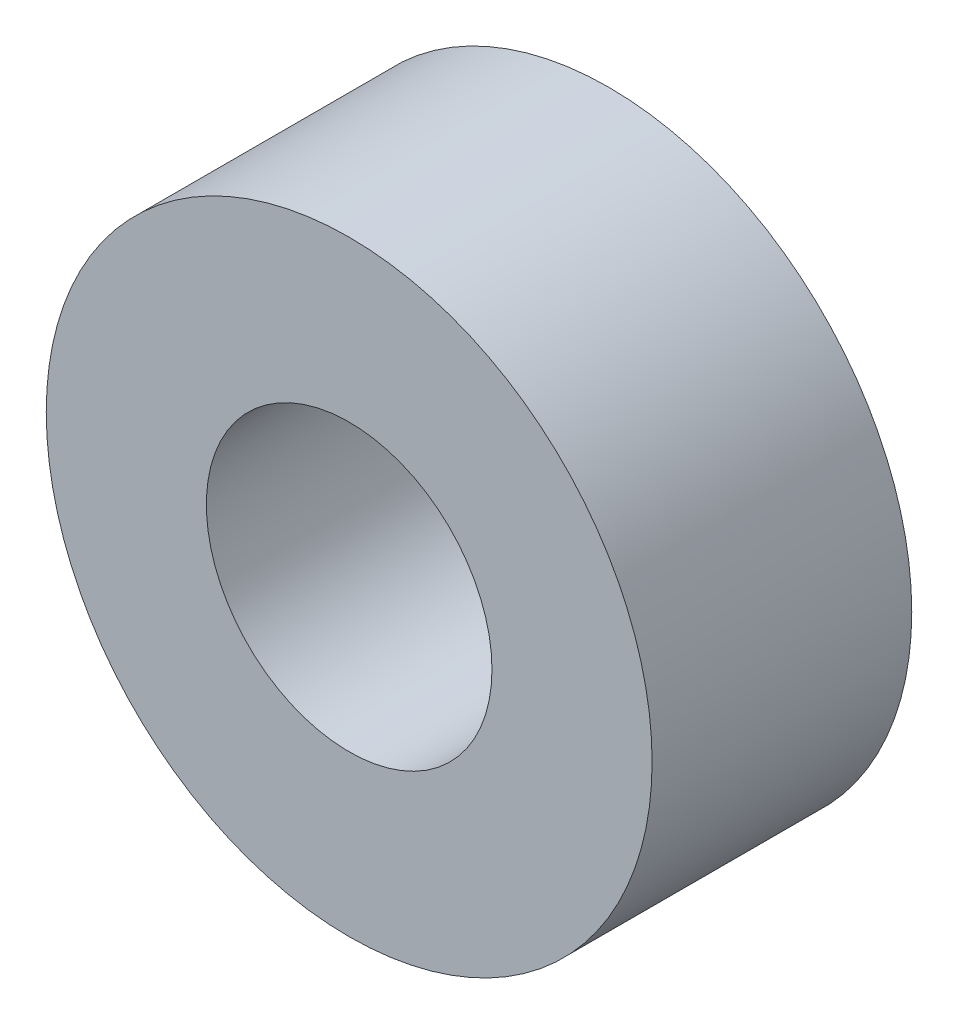
ISO-10303-21;
HEADER;
FILE_DESCRIPTION(('STEP AP214'),'2;1');
FILE_NAME('part.step','',(''),(''),'','','');
FILE_SCHEMA(('AUTOMOTIVE_DESIGN { 1 0 10303 214 1 1 1 1 }'));
ENDSEC;
DATA;
#1=APPLICATION_CONTEXT('core data for automotive mechanical design processes');
#2=APPLICATION_PROTOCOL_DEFINITION('international standard','automotive_design',2000,#1);
#3=PRODUCT_CONTEXT('',#1,'mechanical');
#4=PRODUCT('Part','Part','',(#3));
#5=PRODUCT_RELATED_PRODUCT_CATEGORY('part','',(#4));
#6=PRODUCT_DEFINITION_FORMATION('','',#4);
#7=PRODUCT_DEFINITION_CONTEXT('part definition',#1,'design');
#8=PRODUCT_DEFINITION('design','',#6,#7);
#9=PRODUCT_DEFINITION_SHAPE('','',#8);
#10=(LENGTH_UNIT() NAMED_UNIT(*) SI_UNIT(.MILLI.,.METRE.));
#11=(NAMED_UNIT(*) PLANE_ANGLE_UNIT() SI_UNIT($,.RADIAN.));
#12=(NAMED_UNIT(*) SI_UNIT($,.STERADIAN.) SOLID_ANGLE_UNIT());
#13=UNCERTAINTY_MEASURE_WITH_UNIT(LENGTH_MEASURE(1.E-05),#10,'distance_accuracy_value','');
#14=(GEOMETRIC_REPRESENTATION_CONTEXT(3) GLOBAL_UNCERTAINTY_ASSIGNED_CONTEXT((#13)) GLOBAL_UNIT_ASSIGNED_CONTEXT((#10,
#11,#12)) REPRESENTATION_CONTEXT('',''));
#15=CARTESIAN_POINT('',(0.,0.,0.));
#16=DIRECTION('',(0.,0.,1.));
#17=DIRECTION('',(1.,0.,0.));
#18=AXIS2_PLACEMENT_3D('',#15,#16,#17);
#19=CARTESIAN_POINT('',(0.,0.,3.));
#20=DIRECTION('',(0.,0.,1.));
#21=DIRECTION('',(1.,0.,0.));
#22=AXIS2_PLACEMENT_3D('',#19,#20,#21);
#23=PLANE('',#22);
#24=CARTESIAN_POINT('',(0.,0.,3.));
#25=DIRECTION('',(0.,0.,1.));
#26=DIRECTION('',(1.,0.,0.));
#27=AXIS2_PLACEMENT_3D('',#24,#25,#26);
#28=CIRCLE('',#27,3.5);
#29=CARTESIAN_POINT('',(3.5,0.,3.));
#30=VERTEX_POINT('',#29);
#31=EDGE_CURVE('E10',#30,#30,#28,.T.);
#32=ORIENTED_EDGE('',*,*,#31,.T.);
#33=EDGE_LOOP('',(#32));
#34=FACE_BOUND('',#33,.T.);
#35=CARTESIAN_POINT('',(0.,0.,3.));
#36=DIRECTION('',(0.,0.,1.));
#37=DIRECTION('',(1.,0.,0.));
#38=AXIS2_PLACEMENT_3D('',#35,#36,#37);
#39=CIRCLE('',#38,1.65);
#40=CARTESIAN_POINT('',(1.65,0.,3.));
#41=VERTEX_POINT('',#40);
#42=EDGE_CURVE('E48',#41,#41,#39,.T.);
#43=ORIENTED_EDGE('',*,*,#42,.F.);
#44=EDGE_LOOP('',(#43));
#45=FACE_BOUND('',#44,.T.);
#46=ADVANCED_FACE('F40',(#34,#45),#23,.T.);
#47=CARTESIAN_POINT('',(0.,0.,0.));
#48=DIRECTION('',(0.,0.,1.));
#49=DIRECTION('',(1.,0.,0.));
#50=AXIS2_PLACEMENT_3D('',#47,#48,#49);
#51=PLANE('',#50);
#52=CARTESIAN_POINT('',(0.,0.,0.));
#53=DIRECTION('',(0.,0.,1.));
#54=DIRECTION('',(1.,0.,0.));
#55=AXIS2_PLACEMENT_3D('',#52,#53,#54);
#56=CIRCLE('',#55,3.5);
#57=CARTESIAN_POINT('',(3.5,0.,0.));
#58=VERTEX_POINT('',#57);
#59=EDGE_CURVE('E41',#58,#58,#56,.T.);
#60=ORIENTED_EDGE('',*,*,#59,.F.);
#61=EDGE_LOOP('',(#60));
#62=FACE_BOUND('',#61,.T.);
#63=CARTESIAN_POINT('',(0.,0.,0.));
#64=DIRECTION('',(0.,0.,1.));
#65=DIRECTION('',(1.,0.,0.));
#66=AXIS2_PLACEMENT_3D('',#63,#64,#65);
#67=CIRCLE('',#66,1.65);
#68=CARTESIAN_POINT('',(1.65,0.,0.));
#69=VERTEX_POINT('',#68);
#70=EDGE_CURVE('E49',#69,#69,#67,.T.);
#71=ORIENTED_EDGE('',*,*,#70,.T.);
#72=EDGE_LOOP('',(#71));
#73=FACE_BOUND('',#72,.T.);
#74=ADVANCED_FACE('F58',(#62,#73),#51,.F.);
#75=CARTESIAN_POINT('',(0.,0.,3.));
#76=DIRECTION('',(0.,0.,-1.));
#77=DIRECTION('',(-1.,0.,0.));
#78=AXIS2_PLACEMENT_3D('',#75,#76,#77);
#79=CYLINDRICAL_SURFACE('',#78,3.5);
#80=ORIENTED_EDGE('',*,*,#31,.F.);
#81=EDGE_LOOP('',(#80));
#82=FACE_BOUND('',#81,.T.);
#83=ORIENTED_EDGE('',*,*,#59,.T.);
#84=EDGE_LOOP('',(#83));
#85=FACE_BOUND('',#84,.T.);
#86=ADVANCED_FACE('F39',(#82,#85),#79,.T.);
#87=CARTESIAN_POINT('',(0.,0.,3.));
#88=DIRECTION('',(0.,0.,-1.));
#89=DIRECTION('',(-1.,0.,0.));
#90=AXIS2_PLACEMENT_3D('',#87,#88,#89);
#91=CYLINDRICAL_SURFACE('',#90,1.65);
#92=ORIENTED_EDGE('',*,*,#42,.T.);
#93=EDGE_LOOP('',(#92));
#94=FACE_BOUND('',#93,.T.);
#95=ORIENTED_EDGE('',*,*,#70,.F.);
#96=EDGE_LOOP('',(#95));
#97=FACE_BOUND('',#96,.T.);
#98=ADVANCED_FACE('F57',(#94,#97),#91,.F.);
#99=CLOSED_SHELL('',(#46,#74,#86,#98));
#100=MANIFOLD_SOLID_BREP('B2',#99);
#101=ADVANCED_BREP_SHAPE_REPRESENTATION('',(#18,#100),#14);
#102=SHAPE_DEFINITION_REPRESENTATION(#9,#101);
ENDSEC;
END-ISO-10303-21;
